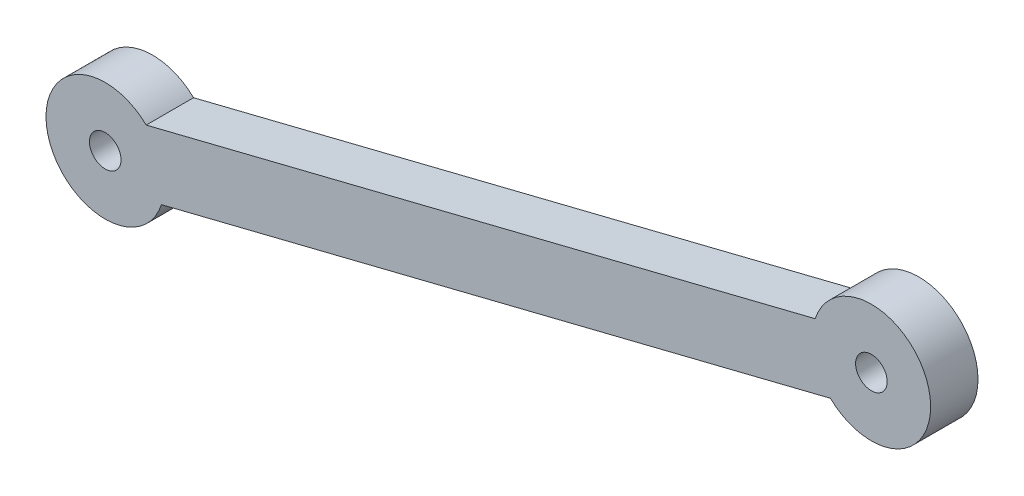
ISO-10303-21;
HEADER;
FILE_DESCRIPTION(('STEP AP214'),'2;1');
FILE_NAME('part.step','',(''),(''),'','','');
FILE_SCHEMA(('AUTOMOTIVE_DESIGN { 1 0 10303 214 1 1 1 1 }'));
ENDSEC;
DATA;
#1=APPLICATION_CONTEXT('core data for automotive mechanical design processes');
#2=APPLICATION_PROTOCOL_DEFINITION('international standard','automotive_design',2000,#1);
#3=PRODUCT_CONTEXT('',#1,'mechanical');
#4=PRODUCT('Part','Part','',(#3));
#5=PRODUCT_RELATED_PRODUCT_CATEGORY('part','',(#4));
#6=PRODUCT_DEFINITION_FORMATION('','',#4);
#7=PRODUCT_DEFINITION_CONTEXT('part definition',#1,'design');
#8=PRODUCT_DEFINITION('design','',#6,#7);
#9=PRODUCT_DEFINITION_SHAPE('','',#8);
#10=(LENGTH_UNIT() NAMED_UNIT(*) SI_UNIT(.MILLI.,.METRE.));
#11=(NAMED_UNIT(*) PLANE_ANGLE_UNIT() SI_UNIT($,.RADIAN.));
#12=(NAMED_UNIT(*) SI_UNIT($,.STERADIAN.) SOLID_ANGLE_UNIT());
#13=UNCERTAINTY_MEASURE_WITH_UNIT(LENGTH_MEASURE(1.E-05),#10,'distance_accuracy_value','');
#14=(GEOMETRIC_REPRESENTATION_CONTEXT(3) GLOBAL_UNCERTAINTY_ASSIGNED_CONTEXT((#13)) GLOBAL_UNIT_ASSIGNED_CONTEXT((#10,
#11,#12)) REPRESENTATION_CONTEXT('',''));
#15=CARTESIAN_POINT('',(0.,0.,0.));
#16=DIRECTION('',(0.,0.,1.));
#17=DIRECTION('',(1.,0.,0.));
#18=AXIS2_PLACEMENT_3D('',#15,#16,#17);
#19=CARTESIAN_POINT('',(-357.92218497876,-2912.58201895236,5.99999999999967));
#20=DIRECTION('',(0.,0.,-1.));
#21=DIRECTION('',(-1.,0.,0.));
#22=AXIS2_PLACEMENT_3D('',#19,#20,#21);
#23=CYLINDRICAL_SURFACE('',#22,7.50000000000014);
#24=CARTESIAN_POINT('',(-357.92218497876,-2912.58201895236,-3.33066907387547E-13));
#25=DIRECTION('',(0.,0.,1.));
#26=DIRECTION('',(1.,0.,0.));
#27=AXIS2_PLACEMENT_3D('',#24,#25,#26);
#28=CIRCLE('',#27,7.50000000000014);
#29=CARTESIAN_POINT('',(-352.734036281149,-2907.16601368173,-3.33066907387547E-13));
#30=VERTEX_POINT('',#29);
#31=CARTESIAN_POINT('',(-350.798661116351,-2914.92837949194,-3.33066907387547E-13));
#32=VERTEX_POINT('',#31);
#33=EDGE_CURVE('E84',#30,#32,#28,.T.);
#34=ORIENTED_EDGE('',*,*,#33,.T.);
#35=DIRECTION('',(0.,0.,-1.));
#36=VECTOR('',#35,1.);
#37=CARTESIAN_POINT('',(-350.798661116351,-2914.92837949194,5.99999999999967));
#38=LINE('',#37,#36);
#39=CARTESIAN_POINT('',(-350.798661116351,-2914.92837949194,5.99999999999967));
#40=VERTEX_POINT('',#39);
#41=EDGE_CURVE('E11',#40,#32,#38,.T.);
#42=ORIENTED_EDGE('',*,*,#41,.F.);
#43=CARTESIAN_POINT('',(-357.92218497876,-2912.58201895236,5.99999999999967));
#44=DIRECTION('',(0.,0.,1.));
#45=DIRECTION('',(1.,0.,0.));
#46=AXIS2_PLACEMENT_3D('',#43,#44,#45);
#47=CIRCLE('',#46,7.50000000000014);
#48=CARTESIAN_POINT('',(-352.734036281149,-2907.16601368173,5.99999999999967));
#49=VERTEX_POINT('',#48);
#50=EDGE_CURVE('E107',#49,#40,#47,.T.);
#51=ORIENTED_EDGE('',*,*,#50,.F.);
#52=DIRECTION('',(0.,0.,-1.));
#53=VECTOR('',#52,1.);
#54=CARTESIAN_POINT('',(-352.734036281149,-2907.16601368173,5.99999999999967));
#55=LINE('',#54,#53);
#56=EDGE_CURVE('E46',#49,#30,#55,.T.);
#57=ORIENTED_EDGE('',*,*,#56,.T.);
#58=EDGE_LOOP('',(#34,#42,#51,#57));
#59=FACE_BOUND('',#58,.T.);
#60=ADVANCED_FACE('F38',(#59),#23,.T.);
#61=CARTESIAN_POINT('',(663.707077011727,-2661.98368993153,5.99999999999967));
#62=DIRECTION('',(-0.24192189559966,0.970295726275998,0.));
#63=DIRECTION('',(-0.970295726275998,-0.24192189559966,0.));
#64=AXIS2_PLACEMENT_3D('',#61,#62,#63);
#65=PLANE('',#64);
#66=DIRECTION('',(0.970295726275998,0.24192189559966,0.));
#67=VECTOR('',#66,1.);
#68=CARTESIAN_POINT('',(663.707077011727,-2661.98368993153,-3.33066907387547E-13));
#69=LINE('',#68,#67);
#70=CARTESIAN_POINT('',(-266.080761048771,-2893.80583466303,-3.33066907387547E-13));
#71=VERTEX_POINT('',#70);
#72=EDGE_CURVE('E65',#32,#71,#69,.T.);
#73=ORIENTED_EDGE('',*,*,#72,.T.);
#74=DIRECTION('',(0.,0.,-1.));
#75=VECTOR('',#74,1.);
#76=CARTESIAN_POINT('',(-266.080761048771,-2893.80583466303,5.99999999999967));
#77=LINE('',#76,#75);
#78=CARTESIAN_POINT('',(-266.080761048771,-2893.80583466303,5.99999999999967));
#79=VERTEX_POINT('',#78);
#80=EDGE_CURVE('E92',#79,#71,#77,.T.);
#81=ORIENTED_EDGE('',*,*,#80,.F.);
#82=DIRECTION('',(0.970295726275998,0.24192189559966,0.));
#83=VECTOR('',#82,1.);
#84=CARTESIAN_POINT('',(663.707077011727,-2661.98368993153,5.99999999999967));
#85=LINE('',#84,#83);
#86=EDGE_CURVE('E110',#40,#79,#85,.T.);
#87=ORIENTED_EDGE('',*,*,#86,.F.);
#88=ORIENTED_EDGE('',*,*,#41,.T.);
#89=EDGE_LOOP('',(#73,#81,#87,#88));
#90=FACE_BOUND('',#89,.T.);
#91=ADVANCED_FACE('F145',(#90),#65,.F.);
#92=CARTESIAN_POINT('',(661.771701846929,-2654.22132412132,5.99999999999967));
#93=DIRECTION('',(-0.24192189559966,0.970295726275998,0.));
#94=DIRECTION('',(-0.970295726275999,-0.24192189559966,0.));
#95=AXIS2_PLACEMENT_3D('',#92,#93,#94);
#96=PLANE('',#95);
#97=DIRECTION('',(0.970295726275998,0.24192189559966,0.));
#98=VECTOR('',#97,1.);
#99=CARTESIAN_POINT('',(661.771701846929,-2654.22132412132,-3.33066907387547E-13));
#100=LINE('',#99,#98);
#101=CARTESIAN_POINT('',(-268.016136213569,-2886.04346885282,-3.33066907387547E-13));
#102=VERTEX_POINT('',#101);
#103=EDGE_CURVE('E78',#30,#102,#100,.T.);
#104=ORIENTED_EDGE('',*,*,#103,.F.);
#105=ORIENTED_EDGE('',*,*,#56,.F.);
#106=DIRECTION('',(0.970295726275998,0.24192189559966,0.));
#107=VECTOR('',#106,1.);
#108=CARTESIAN_POINT('',(661.771701846929,-2654.22132412132,5.99999999999967));
#109=LINE('',#108,#107);
#110=CARTESIAN_POINT('',(-268.016136213569,-2886.04346885282,5.99999999999967));
#111=VERTEX_POINT('',#110);
#112=EDGE_CURVE('E70',#49,#111,#109,.T.);
#113=ORIENTED_EDGE('',*,*,#112,.T.);
#114=DIRECTION('',(0.,0.,-1.));
#115=VECTOR('',#114,1.);
#116=CARTESIAN_POINT('',(-268.016136213569,-2886.04346885282,5.99999999999967));
#117=LINE('',#116,#115);
#118=EDGE_CURVE('E88',#111,#102,#117,.T.);
#119=ORIENTED_EDGE('',*,*,#118,.T.);
#120=EDGE_LOOP('',(#104,#105,#113,#119));
#121=FACE_BOUND('',#120,.T.);
#122=ADVANCED_FACE('F89',(#121),#96,.T.);
#123=CARTESIAN_POINT('',(-357.92218497876,-2912.58201895236,5.99999999999967));
#124=DIRECTION('',(0.,0.,-1.));
#125=DIRECTION('',(-1.,0.,0.));
#126=AXIS2_PLACEMENT_3D('',#123,#124,#125);
#127=CYLINDRICAL_SURFACE('',#126,2.00000000000034);
#128=CARTESIAN_POINT('',(-357.92218497876,-2912.58201895236,5.99999999999967));
#129=DIRECTION('',(0.,0.,1.));
#130=DIRECTION('',(1.,0.,0.));
#131=AXIS2_PLACEMENT_3D('',#128,#129,#130);
#132=CIRCLE('',#131,2.00000000000034);
#133=CARTESIAN_POINT('',(-355.92218497876,-2912.58201895236,5.99999999999967));
#134=VERTEX_POINT('',#133);
#135=EDGE_CURVE('E113',#134,#134,#132,.T.);
#136=ORIENTED_EDGE('',*,*,#135,.T.);
#137=EDGE_LOOP('',(#136));
#138=FACE_BOUND('',#137,.T.);
#139=CARTESIAN_POINT('',(-357.92218497876,-2912.58201895236,-3.33066907387547E-13));
#140=DIRECTION('',(0.,0.,1.));
#141=DIRECTION('',(1.,0.,0.));
#142=AXIS2_PLACEMENT_3D('',#139,#140,#141);
#143=CIRCLE('',#142,2.00000000000034);
#144=CARTESIAN_POINT('',(-355.92218497876,-2912.58201895236,-3.33066907387547E-13));
#145=VERTEX_POINT('',#144);
#146=EDGE_CURVE('E85',#145,#145,#143,.T.);
#147=ORIENTED_EDGE('',*,*,#146,.F.);
#148=EDGE_LOOP('',(#147));
#149=FACE_BOUND('',#148,.T.);
#150=ADVANCED_FACE('F141',(#138,#149),#127,.F.);
#151=CARTESIAN_POINT('',(0.,0.,5.99999999999967));
#152=DIRECTION('',(0.,0.,1.));
#153=DIRECTION('',(1.,0.,0.));
#154=AXIS2_PLACEMENT_3D('',#151,#152,#153);
#155=PLANE('',#154);
#156=ORIENTED_EDGE('',*,*,#50,.T.);
#157=ORIENTED_EDGE('',*,*,#86,.T.);
#158=CARTESIAN_POINT('',(-260.89261235116,-2888.3898293924,5.99999999999967));
#159=DIRECTION('',(0.,0.,-1.));
#160=DIRECTION('',(-0.882947592858937,-0.469471562785872,0.));
#161=AXIS2_PLACEMENT_3D('',#158,#159,#160);
#162=CIRCLE('',#161,7.50000000000014);
#163=EDGE_CURVE('E101',#111,#79,#162,.T.);
#164=ORIENTED_EDGE('',*,*,#163,.F.);
#165=ORIENTED_EDGE('',*,*,#112,.F.);
#166=EDGE_LOOP('',(#156,#157,#164,#165));
#167=FACE_BOUND('',#166,.T.);
#168=ORIENTED_EDGE('',*,*,#135,.F.);
#169=EDGE_LOOP('',(#168));
#170=FACE_BOUND('',#169,.T.);
#171=CARTESIAN_POINT('',(-260.89261235116,-2888.3898293924,5.99999999999967));
#172=DIRECTION('',(0.,0.,-1.));
#173=DIRECTION('',(-0.882947592858937,-0.469471562785872,0.));
#174=AXIS2_PLACEMENT_3D('',#171,#172,#173);
#175=CIRCLE('',#174,2.00000000000034);
#176=CARTESIAN_POINT('',(-262.658507536878,-2889.32877251797,5.99999999999967));
#177=VERTEX_POINT('',#176);
#178=EDGE_CURVE('E93',#177,#177,#175,.T.);
#179=ORIENTED_EDGE('',*,*,#178,.T.);
#180=EDGE_LOOP('',(#179));
#181=FACE_BOUND('',#180,.T.);
#182=ADVANCED_FACE('F122',(#167,#170,#181),#155,.T.);
#183=CARTESIAN_POINT('',(0.,0.,-3.33066907387547E-13));
#184=DIRECTION('',(0.,0.,1.));
#185=DIRECTION('',(1.,0.,0.));
#186=AXIS2_PLACEMENT_3D('',#183,#184,#185);
#187=PLANE('',#186);
#188=ORIENTED_EDGE('',*,*,#33,.F.);
#189=ORIENTED_EDGE('',*,*,#103,.T.);
#190=CARTESIAN_POINT('',(-260.89261235116,-2888.3898293924,-3.33066907387547E-13));
#191=DIRECTION('',(0.,0.,-1.));
#192=DIRECTION('',(-0.882947592858937,-0.469471562785872,0.));
#193=AXIS2_PLACEMENT_3D('',#190,#191,#192);
#194=CIRCLE('',#193,7.50000000000014);
#195=EDGE_CURVE('E82',#102,#71,#194,.T.);
#196=ORIENTED_EDGE('',*,*,#195,.T.);
#197=ORIENTED_EDGE('',*,*,#72,.F.);
#198=EDGE_LOOP('',(#188,#189,#196,#197));
#199=FACE_BOUND('',#198,.T.);
#200=ORIENTED_EDGE('',*,*,#146,.T.);
#201=EDGE_LOOP('',(#200));
#202=FACE_BOUND('',#201,.T.);
#203=CARTESIAN_POINT('',(-260.89261235116,-2888.3898293924,-3.33066907387547E-13));
#204=DIRECTION('',(0.,0.,-1.));
#205=DIRECTION('',(-0.882947592858937,-0.469471562785872,0.));
#206=AXIS2_PLACEMENT_3D('',#203,#204,#205);
#207=CIRCLE('',#206,2.00000000000034);
#208=CARTESIAN_POINT('',(-262.658507536878,-2889.32877251797,-3.33066907387547E-13));
#209=VERTEX_POINT('',#208);
#210=EDGE_CURVE('E98',#209,#209,#207,.T.);
#211=ORIENTED_EDGE('',*,*,#210,.F.);
#212=EDGE_LOOP('',(#211));
#213=FACE_BOUND('',#212,.T.);
#214=ADVANCED_FACE('F79',(#199,#202,#213),#187,.F.);
#215=CARTESIAN_POINT('',(-260.89261235116,-2888.3898293924,5.99999999999967));
#216=DIRECTION('',(0.,0.,-1.));
#217=DIRECTION('',(0.882947592858937,0.469471562785872,0.));
#218=AXIS2_PLACEMENT_3D('',#215,#216,#217);
#219=CYLINDRICAL_SURFACE('',#218,7.50000000000014);
#220=ORIENTED_EDGE('',*,*,#195,.F.);
#221=ORIENTED_EDGE('',*,*,#118,.F.);
#222=ORIENTED_EDGE('',*,*,#163,.T.);
#223=ORIENTED_EDGE('',*,*,#80,.T.);
#224=EDGE_LOOP('',(#220,#221,#222,#223));
#225=FACE_BOUND('',#224,.T.);
#226=ADVANCED_FACE('F96',(#225),#219,.T.);
#227=CARTESIAN_POINT('',(-260.89261235116,-2888.3898293924,5.99999999999967));
#228=DIRECTION('',(0.,0.,-1.));
#229=DIRECTION('',(0.882947592858937,0.469471562785872,0.));
#230=AXIS2_PLACEMENT_3D('',#227,#228,#229);
#231=CYLINDRICAL_SURFACE('',#230,2.00000000000034);
#232=ORIENTED_EDGE('',*,*,#178,.F.);
#233=EDGE_LOOP('',(#232));
#234=FACE_BOUND('',#233,.T.);
#235=ORIENTED_EDGE('',*,*,#210,.T.);
#236=EDGE_LOOP('',(#235));
#237=FACE_BOUND('',#236,.T.);
#238=ADVANCED_FACE('F128',(#234,#237),#231,.F.);
#239=CLOSED_SHELL('',(#60,#91,#122,#150,#182,#214,#226,#238));
#240=MANIFOLD_SOLID_BREP('B2',#239);
#241=ADVANCED_BREP_SHAPE_REPRESENTATION('',(#18,#240),#14);
#242=SHAPE_DEFINITION_REPRESENTATION(#9,#241);
ENDSEC;
END-ISO-10303-21;
